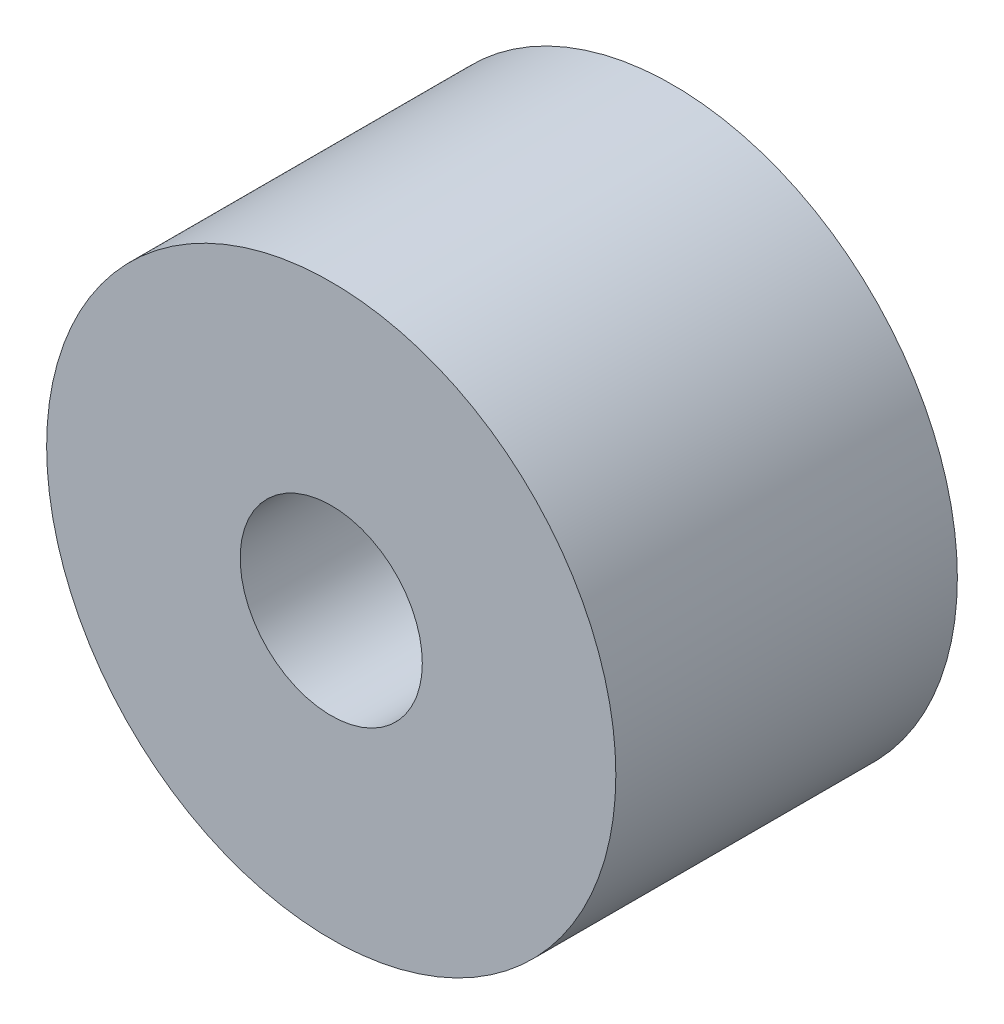
ISO-10303-21;
HEADER;
FILE_DESCRIPTION(('STEP AP214'),'2;1');
FILE_NAME('part.step','',(''),(''),'','','');
FILE_SCHEMA(('AUTOMOTIVE_DESIGN { 1 0 10303 214 1 1 1 1 }'));
ENDSEC;
DATA;
#1=APPLICATION_CONTEXT('core data for automotive mechanical design processes');
#2=APPLICATION_PROTOCOL_DEFINITION('international standard','automotive_design',2000,#1);
#3=PRODUCT_CONTEXT('',#1,'mechanical');
#4=PRODUCT('Part','Part','',(#3));
#5=PRODUCT_RELATED_PRODUCT_CATEGORY('part','',(#4));
#6=PRODUCT_DEFINITION_FORMATION('','',#4);
#7=PRODUCT_DEFINITION_CONTEXT('part definition',#1,'design');
#8=PRODUCT_DEFINITION('design','',#6,#7);
#9=PRODUCT_DEFINITION_SHAPE('','',#8);
#10=(LENGTH_UNIT() NAMED_UNIT(*) SI_UNIT(.MILLI.,.METRE.));
#11=(NAMED_UNIT(*) PLANE_ANGLE_UNIT() SI_UNIT($,.RADIAN.));
#12=(NAMED_UNIT(*) SI_UNIT($,.STERADIAN.) SOLID_ANGLE_UNIT());
#13=UNCERTAINTY_MEASURE_WITH_UNIT(LENGTH_MEASURE(1.E-05),#10,'distance_accuracy_value','');
#14=(GEOMETRIC_REPRESENTATION_CONTEXT(3) GLOBAL_UNCERTAINTY_ASSIGNED_CONTEXT((#13)) GLOBAL_UNIT_ASSIGNED_CONTEXT((#10,
#11,#12)) REPRESENTATION_CONTEXT('',''));
#15=CARTESIAN_POINT('',(0.,0.,0.));
#16=DIRECTION('',(0.,0.,1.));
#17=DIRECTION('',(1.,0.,0.));
#18=AXIS2_PLACEMENT_3D('',#15,#16,#17);
#19=CARTESIAN_POINT('',(0.,0.,6.));
#20=DIRECTION('',(0.,0.,1.));
#21=DIRECTION('',(1.,0.,0.));
#22=AXIS2_PLACEMENT_3D('',#19,#20,#21);
#23=PLANE('',#22);
#24=CARTESIAN_POINT('',(0.,0.,6.));
#25=DIRECTION('',(0.,0.,1.));
#26=DIRECTION('',(1.,0.,0.));
#27=AXIS2_PLACEMENT_3D('',#24,#25,#26);
#28=CIRCLE('',#27,5.);
#29=CARTESIAN_POINT('',(5.,0.,6.));
#30=VERTEX_POINT('',#29);
#31=EDGE_CURVE('E10',#30,#30,#28,.T.);
#32=ORIENTED_EDGE('',*,*,#31,.T.);
#33=EDGE_LOOP('',(#32));
#34=FACE_BOUND('',#33,.T.);
#35=CARTESIAN_POINT('',(0.,0.,6.));
#36=DIRECTION('',(0.,0.,1.));
#37=DIRECTION('',(1.,0.,0.));
#38=AXIS2_PLACEMENT_3D('',#35,#36,#37);
#39=CIRCLE('',#38,1.6);
#40=CARTESIAN_POINT('',(1.6,0.,6.));
#41=VERTEX_POINT('',#40);
#42=EDGE_CURVE('E48',#41,#41,#39,.T.);
#43=ORIENTED_EDGE('',*,*,#42,.F.);
#44=EDGE_LOOP('',(#43));
#45=FACE_BOUND('',#44,.T.);
#46=ADVANCED_FACE('F37',(#34,#45),#23,.T.);
#47=CARTESIAN_POINT('',(0.,0.,0.));
#48=DIRECTION('',(0.,0.,1.));
#49=DIRECTION('',(1.,0.,0.));
#50=AXIS2_PLACEMENT_3D('',#47,#48,#49);
#51=PLANE('',#50);
#52=CARTESIAN_POINT('',(0.,0.,0.));
#53=DIRECTION('',(0.,0.,1.));
#54=DIRECTION('',(1.,0.,0.));
#55=AXIS2_PLACEMENT_3D('',#52,#53,#54);
#56=CIRCLE('',#55,5.);
#57=CARTESIAN_POINT('',(5.,0.,0.));
#58=VERTEX_POINT('',#57);
#59=EDGE_CURVE('E41',#58,#58,#56,.T.);
#60=ORIENTED_EDGE('',*,*,#59,.F.);
#61=EDGE_LOOP('',(#60));
#62=FACE_BOUND('',#61,.T.);
#63=CARTESIAN_POINT('',(0.,0.,0.));
#64=DIRECTION('',(0.,0.,1.));
#65=DIRECTION('',(1.,0.,0.));
#66=AXIS2_PLACEMENT_3D('',#63,#64,#65);
#67=CIRCLE('',#66,1.6);
#68=CARTESIAN_POINT('',(1.6,0.,0.));
#69=VERTEX_POINT('',#68);
#70=EDGE_CURVE('E50',#69,#69,#67,.T.);
#71=ORIENTED_EDGE('',*,*,#70,.T.);
#72=EDGE_LOOP('',(#71));
#73=FACE_BOUND('',#72,.T.);
#74=ADVANCED_FACE('F60',(#62,#73),#51,.F.);
#75=CARTESIAN_POINT('',(0.,0.,6.));
#76=DIRECTION('',(0.,0.,-1.));
#77=DIRECTION('',(-1.,0.,0.));
#78=AXIS2_PLACEMENT_3D('',#75,#76,#77);
#79=CYLINDRICAL_SURFACE('',#78,5.);
#80=ORIENTED_EDGE('',*,*,#31,.F.);
#81=EDGE_LOOP('',(#80));
#82=FACE_BOUND('',#81,.T.);
#83=ORIENTED_EDGE('',*,*,#59,.T.);
#84=EDGE_LOOP('',(#83));
#85=FACE_BOUND('',#84,.T.);
#86=ADVANCED_FACE('F39',(#82,#85),#79,.T.);
#87=CARTESIAN_POINT('',(0.,0.,6.));
#88=DIRECTION('',(0.,0.,-1.));
#89=DIRECTION('',(-1.,0.,0.));
#90=AXIS2_PLACEMENT_3D('',#87,#88,#89);
#91=CYLINDRICAL_SURFACE('',#90,1.6);
#92=ORIENTED_EDGE('',*,*,#42,.T.);
#93=EDGE_LOOP('',(#92));
#94=FACE_BOUND('',#93,.T.);
#95=ORIENTED_EDGE('',*,*,#70,.F.);
#96=EDGE_LOOP('',(#95));
#97=FACE_BOUND('',#96,.T.);
#98=ADVANCED_FACE('F56',(#94,#97),#91,.F.);
#99=CLOSED_SHELL('',(#46,#74,#86,#98));
#100=MANIFOLD_SOLID_BREP('B2',#99);
#101=ADVANCED_BREP_SHAPE_REPRESENTATION('',(#18,#100),#14);
#102=SHAPE_DEFINITION_REPRESENTATION(#9,#101);
ENDSEC;
END-ISO-10303-21;
